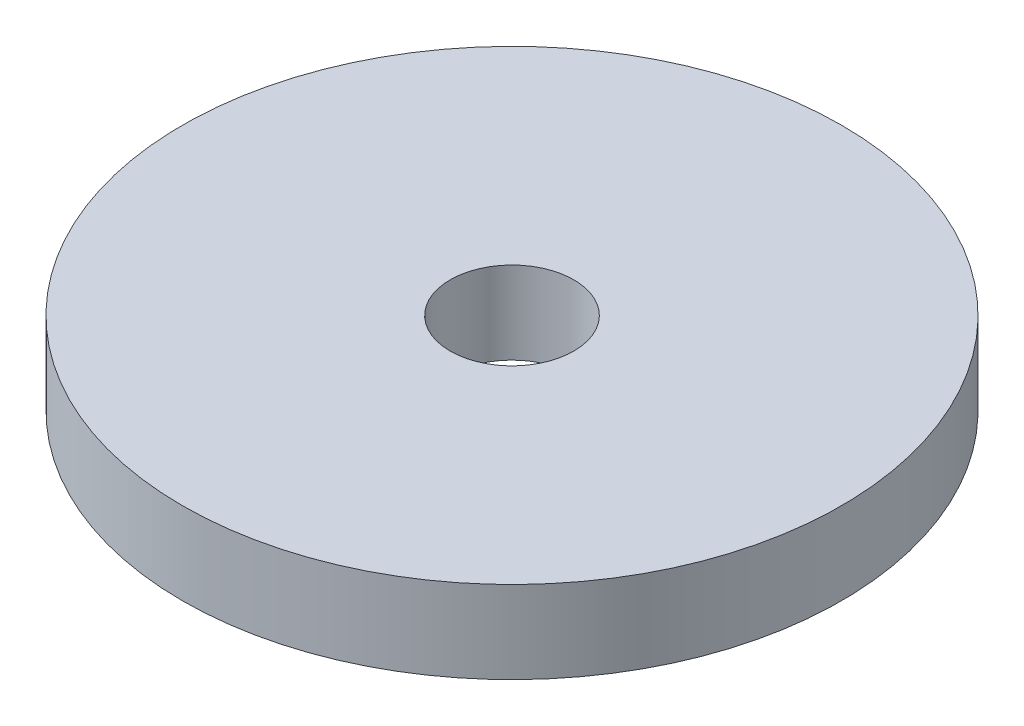
ISO-10303-21;
HEADER;
FILE_DESCRIPTION(('STEP AP214'),'2;1');
FILE_NAME('part.step','',(''),(''),'','','');
FILE_SCHEMA(('AUTOMOTIVE_DESIGN { 1 0 10303 214 1 1 1 1 }'));
ENDSEC;
DATA;
#1=APPLICATION_CONTEXT('core data for automotive mechanical design processes');
#2=APPLICATION_PROTOCOL_DEFINITION('international standard','automotive_design',2000,#1);
#3=PRODUCT_CONTEXT('',#1,'mechanical');
#4=PRODUCT('Part','Part','',(#3));
#5=PRODUCT_RELATED_PRODUCT_CATEGORY('part','',(#4));
#6=PRODUCT_DEFINITION_FORMATION('','',#4);
#7=PRODUCT_DEFINITION_CONTEXT('part definition',#1,'design');
#8=PRODUCT_DEFINITION('design','',#6,#7);
#9=PRODUCT_DEFINITION_SHAPE('','',#8);
#10=(LENGTH_UNIT() NAMED_UNIT(*) SI_UNIT(.MILLI.,.METRE.));
#11=(NAMED_UNIT(*) PLANE_ANGLE_UNIT() SI_UNIT($,.RADIAN.));
#12=(NAMED_UNIT(*) SI_UNIT($,.STERADIAN.) SOLID_ANGLE_UNIT());
#13=UNCERTAINTY_MEASURE_WITH_UNIT(LENGTH_MEASURE(1.E-05),#10,'distance_accuracy_value','');
#14=(GEOMETRIC_REPRESENTATION_CONTEXT(3) GLOBAL_UNCERTAINTY_ASSIGNED_CONTEXT((#13)) GLOBAL_UNIT_ASSIGNED_CONTEXT((#10,
#11,#12)) REPRESENTATION_CONTEXT('',''));
#15=CARTESIAN_POINT('',(0.,0.,0.));
#16=DIRECTION('',(0.,0.,1.));
#17=DIRECTION('',(1.,0.,0.));
#18=AXIS2_PLACEMENT_3D('',#15,#16,#17);
#19=CARTESIAN_POINT('',(0.,3.175,0.));
#20=DIRECTION('',(0.,1.,0.));
#21=DIRECTION('',(0.,0.,1.));
#22=AXIS2_PLACEMENT_3D('',#19,#20,#21);
#23=PLANE('',#22);
#24=CARTESIAN_POINT('',(0.,3.175,0.));
#25=DIRECTION('',(0.,1.,0.));
#26=DIRECTION('',(0.,0.,1.));
#27=AXIS2_PLACEMENT_3D('',#24,#25,#26);
#28=CIRCLE('',#27,12.7);
#29=CARTESIAN_POINT('',(0.,3.175,12.7));
#30=VERTEX_POINT('',#29);
#31=EDGE_CURVE('E11',#30,#30,#28,.T.);
#32=ORIENTED_EDGE('',*,*,#31,.T.);
#33=EDGE_LOOP('',(#32));
#34=FACE_BOUND('',#33,.T.);
#35=CARTESIAN_POINT('',(0.,3.175,0.));
#36=DIRECTION('',(0.,1.,0.));
#37=DIRECTION('',(0.,0.,1.));
#38=AXIS2_PLACEMENT_3D('',#35,#36,#37);
#39=CIRCLE('',#38,2.38125);
#40=CARTESIAN_POINT('',(0.,3.175,2.38125));
#41=VERTEX_POINT('',#40);
#42=EDGE_CURVE('E55',#41,#41,#39,.T.);
#43=ORIENTED_EDGE('',*,*,#42,.F.);
#44=EDGE_LOOP('',(#43));
#45=FACE_BOUND('',#44,.T.);
#46=ADVANCED_FACE('F42',(#34,#45),#23,.T.);
#47=CARTESIAN_POINT('',(0.,0.,0.));
#48=DIRECTION('',(0.,1.,0.));
#49=DIRECTION('',(0.,0.,1.));
#50=AXIS2_PLACEMENT_3D('',#47,#48,#49);
#51=PLANE('',#50);
#52=CARTESIAN_POINT('',(0.,0.,0.));
#53=DIRECTION('',(0.,1.,0.));
#54=DIRECTION('',(0.,0.,1.));
#55=AXIS2_PLACEMENT_3D('',#52,#53,#54);
#56=CIRCLE('',#55,12.7);
#57=CARTESIAN_POINT('',(0.,0.,12.7));
#58=VERTEX_POINT('',#57);
#59=EDGE_CURVE('E46',#58,#58,#56,.T.);
#60=ORIENTED_EDGE('',*,*,#59,.F.);
#61=EDGE_LOOP('',(#60));
#62=FACE_BOUND('',#61,.T.);
#63=CARTESIAN_POINT('',(0.,0.,0.));
#64=DIRECTION('',(0.,1.,0.));
#65=DIRECTION('',(0.,0.,1.));
#66=AXIS2_PLACEMENT_3D('',#63,#64,#65);
#67=CIRCLE('',#66,2.38125);
#68=CARTESIAN_POINT('',(0.,0.,2.38125));
#69=VERTEX_POINT('',#68);
#70=EDGE_CURVE('E58',#69,#69,#67,.T.);
#71=ORIENTED_EDGE('',*,*,#70,.T.);
#72=EDGE_LOOP('',(#71));
#73=FACE_BOUND('',#72,.T.);
#74=ADVANCED_FACE('F70',(#62,#73),#51,.F.);
#75=CARTESIAN_POINT('',(0.,3.175,0.));
#76=DIRECTION('',(0.,-1.,0.));
#77=DIRECTION('',(0.,0.,-1.));
#78=AXIS2_PLACEMENT_3D('',#75,#76,#77);
#79=CYLINDRICAL_SURFACE('',#78,12.7);
#80=ORIENTED_EDGE('',*,*,#31,.F.);
#81=EDGE_LOOP('',(#80));
#82=FACE_BOUND('',#81,.T.);
#83=ORIENTED_EDGE('',*,*,#59,.T.);
#84=EDGE_LOOP('',(#83));
#85=FACE_BOUND('',#84,.T.);
#86=ADVANCED_FACE('F44',(#82,#85),#79,.T.);
#87=CARTESIAN_POINT('',(0.,3.175,0.));
#88=DIRECTION('',(0.,-1.,0.));
#89=DIRECTION('',(0.,0.,-1.));
#90=AXIS2_PLACEMENT_3D('',#87,#88,#89);
#91=CYLINDRICAL_SURFACE('',#90,2.38125);
#92=ORIENTED_EDGE('',*,*,#42,.T.);
#93=EDGE_LOOP('',(#92));
#94=FACE_BOUND('',#93,.T.);
#95=ORIENTED_EDGE('',*,*,#70,.F.);
#96=EDGE_LOOP('',(#95));
#97=FACE_BOUND('',#96,.T.);
#98=ADVANCED_FACE('F66',(#94,#97),#91,.F.);
#99=CLOSED_SHELL('',(#46,#74,#86,#98));
#100=MANIFOLD_SOLID_BREP('B2',#99);
#101=ADVANCED_BREP_SHAPE_REPRESENTATION('',(#18,#100),#14);
#102=SHAPE_DEFINITION_REPRESENTATION(#9,#101);
ENDSEC;
END-ISO-10303-21;
